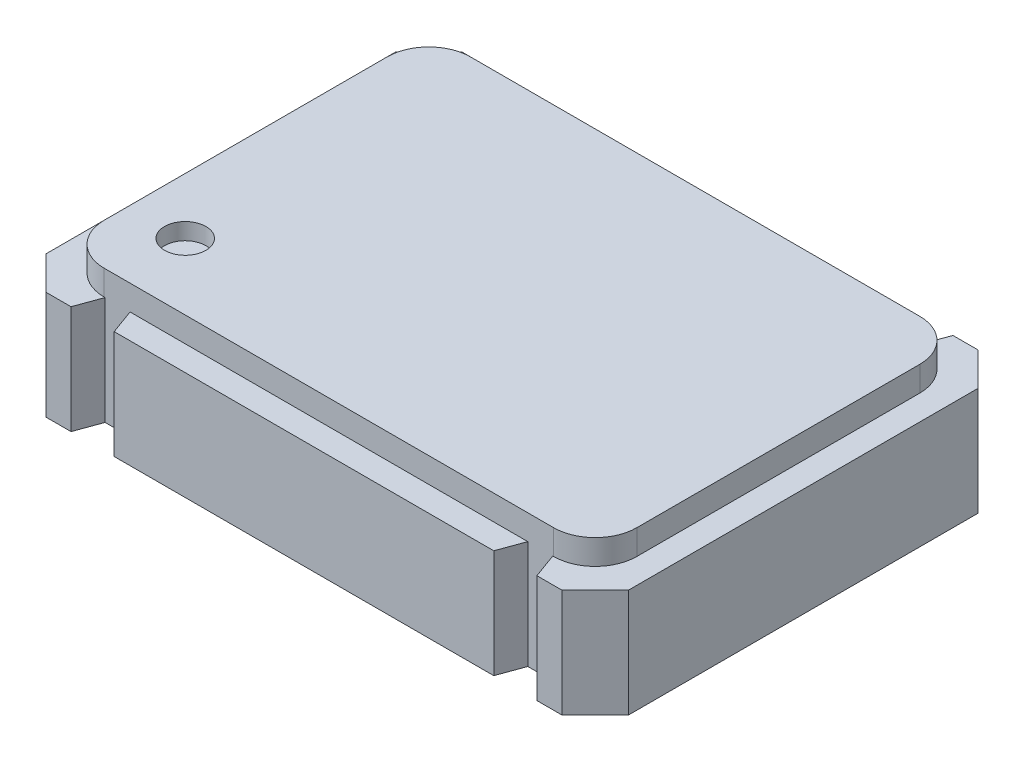
ISO-10303-21;
HEADER;
FILE_DESCRIPTION(('STEP AP214'),'2;1');
FILE_NAME('part.step','',(''),(''),'','','');
FILE_SCHEMA(('AUTOMOTIVE_DESIGN { 1 0 10303 214 1 1 1 1 }'));
ENDSEC;
DATA;
#1=APPLICATION_CONTEXT('core data for automotive mechanical design processes');
#2=APPLICATION_PROTOCOL_DEFINITION('international standard','automotive_design',2000,#1);
#3=PRODUCT_CONTEXT('',#1,'mechanical');
#4=PRODUCT('Part','Part','',(#3));
#5=PRODUCT_RELATED_PRODUCT_CATEGORY('part','',(#4));
#6=PRODUCT_DEFINITION_FORMATION('','',#4);
#7=PRODUCT_DEFINITION_CONTEXT('part definition',#1,'design');
#8=PRODUCT_DEFINITION('design','',#6,#7);
#9=PRODUCT_DEFINITION_SHAPE('','',#8);
#10=(LENGTH_UNIT() NAMED_UNIT(*) SI_UNIT(.MILLI.,.METRE.));
#11=(NAMED_UNIT(*) PLANE_ANGLE_UNIT() SI_UNIT($,.RADIAN.));
#12=(NAMED_UNIT(*) SI_UNIT($,.STERADIAN.) SOLID_ANGLE_UNIT());
#13=UNCERTAINTY_MEASURE_WITH_UNIT(LENGTH_MEASURE(1.E-05),#10,'distance_accuracy_value','');
#14=(GEOMETRIC_REPRESENTATION_CONTEXT(3) GLOBAL_UNCERTAINTY_ASSIGNED_CONTEXT((#13)) GLOBAL_UNIT_ASSIGNED_CONTEXT((#10,
#11,#12)) REPRESENTATION_CONTEXT('',''));
#15=CARTESIAN_POINT('',(0.,0.,0.));
#16=DIRECTION('',(0.,0.,1.));
#17=DIRECTION('',(1.,0.,0.));
#18=AXIS2_PLACEMENT_3D('',#15,#16,#17);
#19=CARTESIAN_POINT('',(2.69,1.3,-2.2));
#20=DIRECTION('',(0.,0.,1.));
#21=DIRECTION('',(1.,0.,0.));
#22=AXIS2_PLACEMENT_3D('',#19,#20,#21);
#23=PLANE('',#22);
#24=DIRECTION('',(-1.,0.,0.));
#25=VECTOR('',#24,1.);
#26=CARTESIAN_POINT('',(-3.2,1.6,-2.2));
#27=LINE('',#26,#25);
#28=CARTESIAN_POINT('',(2.7,1.6,-2.2));
#29=VERTEX_POINT('',#28);
#30=CARTESIAN_POINT('',(-2.7,1.6,-2.2));
#31=VERTEX_POINT('',#30);
#32=EDGE_CURVE('E412',#29,#31,#27,.T.);
#33=ORIENTED_EDGE('',*,*,#32,.F.);
#34=DIRECTION('',(0.,-1.,0.));
#35=VECTOR('',#34,1.);
#36=CARTESIAN_POINT('',(2.7,1.3,-2.2));
#37=LINE('',#36,#35);
#38=CARTESIAN_POINT('',(2.7,1.3,-2.2));
#39=VERTEX_POINT('',#38);
#40=EDGE_CURVE('E358',#29,#39,#37,.T.);
#41=ORIENTED_EDGE('',*,*,#40,.T.);
#42=DIRECTION('',(-1.,0.,0.));
#43=VECTOR('',#42,1.);
#44=CARTESIAN_POINT('',(-3.2,1.3,-2.2));
#45=LINE('',#44,#43);
#46=CARTESIAN_POINT('',(2.69,1.3,-2.2));
#47=VERTEX_POINT('',#46);
#48=EDGE_CURVE('E318',#39,#47,#45,.T.);
#49=ORIENTED_EDGE('',*,*,#48,.T.);
#50=DIRECTION('',(0.,-1.,0.));
#51=VECTOR('',#50,1.);
#52=CARTESIAN_POINT('',(2.69,1.3,-2.2));
#53=LINE('',#52,#51);
#54=CARTESIAN_POINT('',(2.69,0.,-2.2));
#55=VERTEX_POINT('',#54);
#56=EDGE_CURVE('E473',#47,#55,#53,.T.);
#57=ORIENTED_EDGE('',*,*,#56,.T.);
#58=DIRECTION('',(-1.,0.,0.));
#59=VECTOR('',#58,1.);
#60=CARTESIAN_POINT('',(2.69,0.,-2.2));
#61=LINE('',#60,#59);
#62=CARTESIAN_POINT('',(2.39,0.,-2.2));
#63=VERTEX_POINT('',#62);
#64=EDGE_CURVE('E253',#55,#63,#61,.T.);
#65=ORIENTED_EDGE('',*,*,#64,.T.);
#66=DIRECTION('',(0.,-1.,0.));
#67=VECTOR('',#66,1.);
#68=CARTESIAN_POINT('',(2.39,0.,-2.2));
#69=LINE('',#68,#67);
#70=CARTESIAN_POINT('',(2.39,1.3,-2.2));
#71=VERTEX_POINT('',#70);
#72=EDGE_CURVE('E281',#71,#63,#69,.T.);
#73=ORIENTED_EDGE('',*,*,#72,.F.);
#74=DIRECTION('',(1.,0.,0.));
#75=VECTOR('',#74,1.);
#76=CARTESIAN_POINT('',(2.39,1.3,-2.2));
#77=LINE('',#76,#75);
#78=CARTESIAN_POINT('',(-2.39,1.3,-2.2));
#79=VERTEX_POINT('',#78);
#80=EDGE_CURVE('E260',#79,#71,#77,.T.);
#81=ORIENTED_EDGE('',*,*,#80,.F.);
#82=DIRECTION('',(0.,1.,0.));
#83=VECTOR('',#82,1.);
#84=CARTESIAN_POINT('',(-2.39,1.3,-2.2));
#85=LINE('',#84,#83);
#86=CARTESIAN_POINT('',(-2.39,0.,-2.2));
#87=VERTEX_POINT('',#86);
#88=EDGE_CURVE('E257',#87,#79,#85,.T.);
#89=ORIENTED_EDGE('',*,*,#88,.F.);
#90=CARTESIAN_POINT('',(-2.69,0.,-2.2));
#91=VERTEX_POINT('',#90);
#92=EDGE_CURVE('E240',#87,#91,#61,.T.);
#93=ORIENTED_EDGE('',*,*,#92,.T.);
#94=DIRECTION('',(0.,-1.,0.));
#95=VECTOR('',#94,1.);
#96=CARTESIAN_POINT('',(-2.69,1.3,-2.2));
#97=LINE('',#96,#95);
#98=CARTESIAN_POINT('',(-2.69,1.3,-2.2));
#99=VERTEX_POINT('',#98);
#100=EDGE_CURVE('E399',#99,#91,#97,.T.);
#101=ORIENTED_EDGE('',*,*,#100,.F.);
#102=CARTESIAN_POINT('',(-2.7,1.3,-2.2));
#103=VERTEX_POINT('',#102);
#104=EDGE_CURVE('E392',#99,#103,#45,.T.);
#105=ORIENTED_EDGE('',*,*,#104,.T.);
#106=DIRECTION('',(0.,-1.,0.));
#107=VECTOR('',#106,1.);
#108=CARTESIAN_POINT('',(-2.7,1.3,-2.2));
#109=LINE('',#108,#107);
#110=EDGE_CURVE('E356',#103,#31,#109,.F.);
#111=ORIENTED_EDGE('',*,*,#110,.T.);
#112=EDGE_LOOP('',(#33,#41,#49,#57,#65,#73,#81,#89,#93,#101,#105,#111));
#113=FACE_BOUND('',#112,.T.);
#114=ADVANCED_FACE('F33',(#113),#23,.F.);
#115=CARTESIAN_POINT('',(-2.69,1.3,2.2));
#116=DIRECTION('',(0.,0.,-1.));
#117=DIRECTION('',(-1.,0.,0.));
#118=AXIS2_PLACEMENT_3D('',#115,#116,#117);
#119=PLANE('',#118);
#120=DIRECTION('',(1.,0.,0.));
#121=VECTOR('',#120,1.);
#122=CARTESIAN_POINT('',(3.2,1.3,2.2));
#123=LINE('',#122,#121);
#124=CARTESIAN_POINT('',(2.69,1.3,2.2));
#125=VERTEX_POINT('',#124);
#126=CARTESIAN_POINT('',(2.7,1.3,2.2));
#127=VERTEX_POINT('',#126);
#128=EDGE_CURVE('E323',#125,#127,#123,.T.);
#129=ORIENTED_EDGE('',*,*,#128,.T.);
#130=DIRECTION('',(0.,-1.,0.));
#131=VECTOR('',#130,1.);
#132=CARTESIAN_POINT('',(2.7,1.3,2.2));
#133=LINE('',#132,#131);
#134=CARTESIAN_POINT('',(2.7,1.6,2.2));
#135=VERTEX_POINT('',#134);
#136=EDGE_CURVE('E381',#127,#135,#133,.F.);
#137=ORIENTED_EDGE('',*,*,#136,.T.);
#138=DIRECTION('',(1.,0.,0.));
#139=VECTOR('',#138,1.);
#140=CARTESIAN_POINT('',(3.2,1.6,2.2));
#141=LINE('',#140,#139);
#142=CARTESIAN_POINT('',(-2.7,1.6,2.2));
#143=VERTEX_POINT('',#142);
#144=EDGE_CURVE('E415',#143,#135,#141,.T.);
#145=ORIENTED_EDGE('',*,*,#144,.F.);
#146=DIRECTION('',(0.,-1.,0.));
#147=VECTOR('',#146,1.);
#148=CARTESIAN_POINT('',(-2.7,1.3,2.2));
#149=LINE('',#148,#147);
#150=CARTESIAN_POINT('',(-2.7,1.3,2.2));
#151=VERTEX_POINT('',#150);
#152=EDGE_CURVE('E379',#143,#151,#149,.T.);
#153=ORIENTED_EDGE('',*,*,#152,.T.);
#154=CARTESIAN_POINT('',(-2.69,1.3,2.2));
#155=VERTEX_POINT('',#154);
#156=EDGE_CURVE('E427',#151,#155,#123,.T.);
#157=ORIENTED_EDGE('',*,*,#156,.T.);
#158=DIRECTION('',(0.,-1.,0.));
#159=VECTOR('',#158,1.);
#160=CARTESIAN_POINT('',(-2.69,1.3,2.2));
#161=LINE('',#160,#159);
#162=CARTESIAN_POINT('',(-2.69,0.,2.2));
#163=VERTEX_POINT('',#162);
#164=EDGE_CURVE('E479',#155,#163,#161,.T.);
#165=ORIENTED_EDGE('',*,*,#164,.T.);
#166=DIRECTION('',(1.,0.,0.));
#167=VECTOR('',#166,1.);
#168=CARTESIAN_POINT('',(-2.69,0.,2.2));
#169=LINE('',#168,#167);
#170=CARTESIAN_POINT('',(-2.39,0.,2.2));
#171=VERTEX_POINT('',#170);
#172=EDGE_CURVE('E289',#163,#171,#169,.T.);
#173=ORIENTED_EDGE('',*,*,#172,.T.);
#174=DIRECTION('',(0.,-1.,0.));
#175=VECTOR('',#174,1.);
#176=CARTESIAN_POINT('',(-2.39,0.,2.2));
#177=LINE('',#176,#175);
#178=CARTESIAN_POINT('',(-2.39,1.3,2.2));
#179=VERTEX_POINT('',#178);
#180=EDGE_CURVE('E315',#179,#171,#177,.T.);
#181=ORIENTED_EDGE('',*,*,#180,.F.);
#182=DIRECTION('',(-1.,0.,0.));
#183=VECTOR('',#182,1.);
#184=CARTESIAN_POINT('',(-2.39,1.3,2.2));
#185=LINE('',#184,#183);
#186=CARTESIAN_POINT('',(2.39,1.3,2.2));
#187=VERTEX_POINT('',#186);
#188=EDGE_CURVE('E504',#187,#179,#185,.T.);
#189=ORIENTED_EDGE('',*,*,#188,.F.);
#190=DIRECTION('',(0.,1.,0.));
#191=VECTOR('',#190,1.);
#192=CARTESIAN_POINT('',(2.39,1.3,2.2));
#193=LINE('',#192,#191);
#194=CARTESIAN_POINT('',(2.39,0.,2.2));
#195=VERTEX_POINT('',#194);
#196=EDGE_CURVE('E284',#195,#187,#193,.T.);
#197=ORIENTED_EDGE('',*,*,#196,.F.);
#198=CARTESIAN_POINT('',(2.69,0.,2.2));
#199=VERTEX_POINT('',#198);
#200=EDGE_CURVE('E425',#195,#199,#169,.T.);
#201=ORIENTED_EDGE('',*,*,#200,.T.);
#202=DIRECTION('',(0.,-1.,0.));
#203=VECTOR('',#202,1.);
#204=CARTESIAN_POINT('',(2.69,1.3,2.2));
#205=LINE('',#204,#203);
#206=EDGE_CURVE('E297',#125,#199,#205,.T.);
#207=ORIENTED_EDGE('',*,*,#206,.F.);
#208=EDGE_LOOP('',(#129,#137,#145,#153,#157,#165,#173,#181,#189,#197,#201,#207));
#209=FACE_BOUND('',#208,.T.);
#210=ADVANCED_FACE('F524',(#209),#119,.F.);
#211=CARTESIAN_POINT('',(0.,1.3,0.));
#212=DIRECTION('',(0.,1.,0.));
#213=DIRECTION('',(0.,0.,1.));
#214=AXIS2_PLACEMENT_3D('',#211,#212,#213);
#215=PLANE('',#214);
#216=DIRECTION('',(-0.707106781186547,0.,-0.707106781186548));
#217=VECTOR('',#216,1.);
#218=CARTESIAN_POINT('',(3.5,1.3,-2.1));
#219=LINE('',#218,#217);
#220=CARTESIAN_POINT('',(3.5,1.3,-2.1));
#221=VERTEX_POINT('',#220);
#222=CARTESIAN_POINT('',(3.1,1.3,-2.5));
#223=VERTEX_POINT('',#222);
#224=EDGE_CURVE('E452',#221,#223,#219,.T.);
#225=ORIENTED_EDGE('',*,*,#224,.T.);
#226=DIRECTION('',(1.,0.,0.));
#227=VECTOR('',#226,1.);
#228=CARTESIAN_POINT('',(0.,1.3,-2.50000000000001));
#229=LINE('',#228,#227);
#230=CARTESIAN_POINT('',(2.79919107027986,1.3,-2.5));
#231=VERTEX_POINT('',#230);
#232=EDGE_CURVE('E347',#223,#231,#229,.F.);
#233=ORIENTED_EDGE('',*,*,#232,.T.);
#234=DIRECTION('',(0.342020143325667,0.,-0.939692620785909));
#235=VECTOR('',#234,1.);
#236=CARTESIAN_POINT('',(2.69,1.3,-2.2));
#237=LINE('',#236,#235);
#238=EDGE_CURVE('E483',#231,#47,#237,.F.);
#239=ORIENTED_EDGE('',*,*,#238,.T.);
#240=ORIENTED_EDGE('',*,*,#48,.F.);
#241=CARTESIAN_POINT('',(2.7,1.3,-1.7));
#242=DIRECTION('',(0.,1.,0.));
#243=DIRECTION('',(0.,0.,1.));
#244=AXIS2_PLACEMENT_3D('',#241,#242,#243);
#245=CIRCLE('',#244,0.5);
#246=CARTESIAN_POINT('',(3.2,1.3,-1.7));
#247=VERTEX_POINT('',#246);
#248=EDGE_CURVE('E383',#39,#247,#245,.F.);
#249=ORIENTED_EDGE('',*,*,#248,.T.);
#250=DIRECTION('',(0.,0.,-1.));
#251=VECTOR('',#250,1.);
#252=CARTESIAN_POINT('',(3.2,1.3,-2.2));
#253=LINE('',#252,#251);
#254=CARTESIAN_POINT('',(3.2,1.3,1.7));
#255=VERTEX_POINT('',#254);
#256=EDGE_CURVE('E420',#255,#247,#253,.T.);
#257=ORIENTED_EDGE('',*,*,#256,.F.);
#258=CARTESIAN_POINT('',(2.7,1.3,1.7));
#259=DIRECTION('',(0.,1.,0.));
#260=DIRECTION('',(0.,0.,1.));
#261=AXIS2_PLACEMENT_3D('',#258,#259,#260);
#262=CIRCLE('',#261,0.5);
#263=EDGE_CURVE('E41',#255,#127,#262,.F.);
#264=ORIENTED_EDGE('',*,*,#263,.T.);
#265=ORIENTED_EDGE('',*,*,#128,.F.);
#266=DIRECTION('',(-0.342020143325667,0.,-0.939692620785909));
#267=VECTOR('',#266,1.);
#268=CARTESIAN_POINT('',(2.69,1.3,2.2));
#269=LINE('',#268,#267);
#270=CARTESIAN_POINT('',(2.79919107027986,1.3,2.5));
#271=VERTEX_POINT('',#270);
#272=EDGE_CURVE('E290',#125,#271,#269,.F.);
#273=ORIENTED_EDGE('',*,*,#272,.T.);
#274=DIRECTION('',(-1.,0.,0.));
#275=VECTOR('',#274,1.);
#276=CARTESIAN_POINT('',(0.,1.3,2.49999999999999));
#277=LINE('',#276,#275);
#278=CARTESIAN_POINT('',(3.1,1.3,2.5));
#279=VERTEX_POINT('',#278);
#280=EDGE_CURVE('E329',#271,#279,#277,.F.);
#281=ORIENTED_EDGE('',*,*,#280,.T.);
#282=DIRECTION('',(0.707106781186548,0.,-0.707106781186547));
#283=VECTOR('',#282,1.);
#284=CARTESIAN_POINT('',(0.,1.3,5.6));
#285=LINE('',#284,#283);
#286=CARTESIAN_POINT('',(3.5,1.3,2.1));
#287=VERTEX_POINT('',#286);
#288=EDGE_CURVE('E435',#279,#287,#285,.T.);
#289=ORIENTED_EDGE('',*,*,#288,.T.);
#290=DIRECTION('',(0.,0.,-1.));
#291=VECTOR('',#290,1.);
#292=CARTESIAN_POINT('',(3.5,1.3,2.1));
#293=LINE('',#292,#291);
#294=EDGE_CURVE('E449',#287,#221,#293,.T.);
#295=ORIENTED_EDGE('',*,*,#294,.T.);
#296=EDGE_LOOP('',(#225,#233,#239,#240,#249,#257,#264,#265,#273,#281,#289,#295));
#297=FACE_BOUND('',#296,.T.);
#298=ADVANCED_FACE('F545',(#297),#215,.T.);
#299=CARTESIAN_POINT('',(3.5,0.,2.1));
#300=DIRECTION('',(1.,0.,0.));
#301=DIRECTION('',(0.,0.,-1.));
#302=AXIS2_PLACEMENT_3D('',#299,#300,#301);
#303=PLANE('',#302);
#304=ORIENTED_EDGE('',*,*,#294,.F.);
#305=DIRECTION('',(0.,1.,0.));
#306=VECTOR('',#305,1.);
#307=CARTESIAN_POINT('',(3.5,0.,2.1));
#308=LINE('',#307,#306);
#309=CARTESIAN_POINT('',(3.5,0.,2.1));
#310=VERTEX_POINT('',#309);
#311=EDGE_CURVE('E401',#310,#287,#308,.T.);
#312=ORIENTED_EDGE('',*,*,#311,.F.);
#313=DIRECTION('',(0.,0.,-1.));
#314=VECTOR('',#313,1.);
#315=CARTESIAN_POINT('',(3.5,0.,2.1));
#316=LINE('',#315,#314);
#317=CARTESIAN_POINT('',(3.5,0.,-2.1));
#318=VERTEX_POINT('',#317);
#319=EDGE_CURVE('E431',#310,#318,#316,.T.);
#320=ORIENTED_EDGE('',*,*,#319,.T.);
#321=DIRECTION('',(0.,1.,0.));
#322=VECTOR('',#321,1.);
#323=CARTESIAN_POINT('',(3.5,0.,-2.1));
#324=LINE('',#323,#322);
#325=EDGE_CURVE('E448',#318,#221,#324,.T.);
#326=ORIENTED_EDGE('',*,*,#325,.T.);
#327=EDGE_LOOP('',(#304,#312,#320,#326));
#328=FACE_BOUND('',#327,.T.);
#329=ADVANCED_FACE('F559',(#328),#303,.T.);
#330=CARTESIAN_POINT('',(0.,0.,5.6));
#331=DIRECTION('',(0.707106781186547,0.,0.707106781186548));
#332=DIRECTION('',(0.707106781186548,0.,-0.707106781186547));
#333=AXIS2_PLACEMENT_3D('',#330,#331,#332);
#334=PLANE('',#333);
#335=ORIENTED_EDGE('',*,*,#288,.F.);
#336=DIRECTION('',(0.,-1.,0.));
#337=VECTOR('',#336,1.);
#338=CARTESIAN_POINT('',(3.1,0.,2.5));
#339=LINE('',#338,#337);
#340=CARTESIAN_POINT('',(3.1,0.,2.5));
#341=VERTEX_POINT('',#340);
#342=EDGE_CURVE('E319',#279,#341,#339,.T.);
#343=ORIENTED_EDGE('',*,*,#342,.T.);
#344=DIRECTION('',(0.707106781186548,0.,-0.707106781186547));
#345=VECTOR('',#344,1.);
#346=CARTESIAN_POINT('',(0.,0.,5.6));
#347=LINE('',#346,#345);
#348=EDGE_CURVE('E446',#341,#310,#347,.T.);
#349=ORIENTED_EDGE('',*,*,#348,.T.);
#350=ORIENTED_EDGE('',*,*,#311,.T.);
#351=EDGE_LOOP('',(#335,#343,#349,#350));
#352=FACE_BOUND('',#351,.T.);
#353=ADVANCED_FACE('F555',(#352),#334,.T.);
#354=CARTESIAN_POINT('',(-3.5,0.,2.1));
#355=DIRECTION('',(-0.707106781186548,0.,0.707106781186547));
#356=DIRECTION('',(0.707106781186547,0.,0.707106781186548));
#357=AXIS2_PLACEMENT_3D('',#354,#355,#356);
#358=PLANE('',#357);
#359=DIRECTION('',(0.707106781186547,0.,0.707106781186548));
#360=VECTOR('',#359,1.);
#361=CARTESIAN_POINT('',(-3.5,0.,2.1));
#362=LINE('',#361,#360);
#363=CARTESIAN_POINT('',(-3.5,0.,2.1));
#364=VERTEX_POINT('',#363);
#365=CARTESIAN_POINT('',(-3.1,0.,2.5));
#366=VERTEX_POINT('',#365);
#367=EDGE_CURVE('E443',#364,#366,#362,.T.);
#368=ORIENTED_EDGE('',*,*,#367,.T.);
#369=DIRECTION('',(0.,1.,0.));
#370=VECTOR('',#369,1.);
#371=CARTESIAN_POINT('',(-3.1,1.3,2.5));
#372=LINE('',#371,#370);
#373=CARTESIAN_POINT('',(-3.1,1.3,2.5));
#374=VERTEX_POINT('',#373);
#375=EDGE_CURVE('E352',#366,#374,#372,.T.);
#376=ORIENTED_EDGE('',*,*,#375,.T.);
#377=DIRECTION('',(0.707106781186547,0.,0.707106781186548));
#378=VECTOR('',#377,1.);
#379=CARTESIAN_POINT('',(-3.5,1.3,2.1));
#380=LINE('',#379,#378);
#381=CARTESIAN_POINT('',(-3.5,1.3,2.1));
#382=VERTEX_POINT('',#381);
#383=EDGE_CURVE('E460',#382,#374,#380,.T.);
#384=ORIENTED_EDGE('',*,*,#383,.F.);
#385=DIRECTION('',(0.,1.,0.));
#386=VECTOR('',#385,1.);
#387=CARTESIAN_POINT('',(-3.5,0.,2.1));
#388=LINE('',#387,#386);
#389=EDGE_CURVE('E465',#364,#382,#388,.T.);
#390=ORIENTED_EDGE('',*,*,#389,.F.);
#391=EDGE_LOOP('',(#368,#376,#384,#390));
#392=FACE_BOUND('',#391,.T.);
#393=ADVANCED_FACE('F558',(#392),#358,.T.);
#394=CARTESIAN_POINT('',(-3.5,0.,-2.1));
#395=DIRECTION('',(-1.,0.,0.));
#396=DIRECTION('',(0.,0.,1.));
#397=AXIS2_PLACEMENT_3D('',#394,#395,#396);
#398=PLANE('',#397);
#399=DIRECTION('',(0.,0.,1.));
#400=VECTOR('',#399,1.);
#401=CARTESIAN_POINT('',(-3.5,1.3,-2.1));
#402=LINE('',#401,#400);
#403=CARTESIAN_POINT('',(-3.5,1.3,-2.1));
#404=VERTEX_POINT('',#403);
#405=EDGE_CURVE('E457',#404,#382,#402,.T.);
#406=ORIENTED_EDGE('',*,*,#405,.F.);
#407=DIRECTION('',(0.,1.,0.));
#408=VECTOR('',#407,1.);
#409=CARTESIAN_POINT('',(-3.5,0.,-2.1));
#410=LINE('',#409,#408);
#411=CARTESIAN_POINT('',(-3.5,0.,-2.1));
#412=VERTEX_POINT('',#411);
#413=EDGE_CURVE('E467',#412,#404,#410,.T.);
#414=ORIENTED_EDGE('',*,*,#413,.F.);
#415=DIRECTION('',(0.,0.,1.));
#416=VECTOR('',#415,1.);
#417=CARTESIAN_POINT('',(-3.5,0.,-2.1));
#418=LINE('',#417,#416);
#419=EDGE_CURVE('E440',#412,#364,#418,.T.);
#420=ORIENTED_EDGE('',*,*,#419,.T.);
#421=ORIENTED_EDGE('',*,*,#389,.T.);
#422=EDGE_LOOP('',(#406,#414,#420,#421));
#423=FACE_BOUND('',#422,.T.);
#424=ADVANCED_FACE('F563',(#423),#398,.T.);
#425=CARTESIAN_POINT('',(0.,0.,-5.6));
#426=DIRECTION('',(-0.707106781186547,0.,-0.707106781186548));
#427=DIRECTION('',(-0.707106781186548,0.,0.707106781186547));
#428=AXIS2_PLACEMENT_3D('',#425,#426,#427);
#429=PLANE('',#428);
#430=DIRECTION('',(-0.707106781186548,0.,0.707106781186547));
#431=VECTOR('',#430,1.);
#432=CARTESIAN_POINT('',(0.,1.3,-5.6));
#433=LINE('',#432,#431);
#434=CARTESIAN_POINT('',(-3.1,1.3,-2.5));
#435=VERTEX_POINT('',#434);
#436=EDGE_CURVE('E455',#435,#404,#433,.T.);
#437=ORIENTED_EDGE('',*,*,#436,.F.);
#438=DIRECTION('',(0.,-1.,0.));
#439=VECTOR('',#438,1.);
#440=CARTESIAN_POINT('',(-3.1,0.,-2.5));
#441=LINE('',#440,#439);
#442=CARTESIAN_POINT('',(-3.1,0.,-2.5));
#443=VERTEX_POINT('',#442);
#444=EDGE_CURVE('E331',#435,#443,#441,.T.);
#445=ORIENTED_EDGE('',*,*,#444,.T.);
#446=DIRECTION('',(-0.707106781186548,0.,0.707106781186547));
#447=VECTOR('',#446,1.);
#448=CARTESIAN_POINT('',(0.,0.,-5.6));
#449=LINE('',#448,#447);
#450=EDGE_CURVE('E438',#443,#412,#449,.T.);
#451=ORIENTED_EDGE('',*,*,#450,.T.);
#452=ORIENTED_EDGE('',*,*,#413,.T.);
#453=EDGE_LOOP('',(#437,#445,#451,#452));
#454=FACE_BOUND('',#453,.T.);
#455=ADVANCED_FACE('F567',(#454),#429,.T.);
#456=CARTESIAN_POINT('',(3.5,0.,-2.1));
#457=DIRECTION('',(0.707106781186548,0.,-0.707106781186547));
#458=DIRECTION('',(-0.707106781186547,0.,-0.707106781186548));
#459=AXIS2_PLACEMENT_3D('',#456,#457,#458);
#460=PLANE('',#459);
#461=DIRECTION('',(-0.707106781186547,0.,-0.707106781186548));
#462=VECTOR('',#461,1.);
#463=CARTESIAN_POINT('',(3.5,0.,-2.1));
#464=LINE('',#463,#462);
#465=CARTESIAN_POINT('',(3.1,0.,-2.5));
#466=VERTEX_POINT('',#465);
#467=EDGE_CURVE('E434',#318,#466,#464,.T.);
#468=ORIENTED_EDGE('',*,*,#467,.T.);
#469=DIRECTION('',(0.,1.,0.));
#470=VECTOR('',#469,1.);
#471=CARTESIAN_POINT('',(3.1,1.3,-2.5));
#472=LINE('',#471,#470);
#473=EDGE_CURVE('E345',#466,#223,#472,.T.);
#474=ORIENTED_EDGE('',*,*,#473,.T.);
#475=ORIENTED_EDGE('',*,*,#224,.F.);
#476=ORIENTED_EDGE('',*,*,#325,.F.);
#477=EDGE_LOOP('',(#468,#474,#475,#476));
#478=FACE_BOUND('',#477,.T.);
#479=ADVANCED_FACE('F551',(#478),#460,.T.);
#480=CARTESIAN_POINT('',(0.,0.,0.));
#481=DIRECTION('',(0.,1.,0.));
#482=DIRECTION('',(0.,0.,1.));
#483=AXIS2_PLACEMENT_3D('',#480,#481,#482);
#484=PLANE('',#483);
#485=DIRECTION('',(0.342020143325667,0.,-0.939692620785909));
#486=VECTOR('',#485,1.);
#487=CARTESIAN_POINT('',(2.69,0.,-2.2));
#488=LINE('',#487,#486);
#489=CARTESIAN_POINT('',(2.79919107027986,0.,-2.5));
#490=VERTEX_POINT('',#489);
#491=EDGE_CURVE('E254',#490,#55,#488,.F.);
#492=ORIENTED_EDGE('',*,*,#491,.F.);
#493=DIRECTION('',(-1.,0.,0.));
#494=VECTOR('',#493,1.);
#495=CARTESIAN_POINT('',(2.79919107027986,0.,-2.5));
#496=LINE('',#495,#494);
#497=EDGE_CURVE('E343',#490,#466,#496,.F.);
#498=ORIENTED_EDGE('',*,*,#497,.T.);
#499=ORIENTED_EDGE('',*,*,#467,.F.);
#500=ORIENTED_EDGE('',*,*,#319,.F.);
#501=ORIENTED_EDGE('',*,*,#348,.F.);
#502=DIRECTION('',(1.,0.,0.));
#503=VECTOR('',#502,1.);
#504=CARTESIAN_POINT('',(3.1,0.,2.5));
#505=LINE('',#504,#503);
#506=CARTESIAN_POINT('',(2.79919107027986,0.,2.5));
#507=VERTEX_POINT('',#506);
#508=EDGE_CURVE('E325',#341,#507,#505,.F.);
#509=ORIENTED_EDGE('',*,*,#508,.T.);
#510=DIRECTION('',(-0.342020143325667,0.,-0.939692620785909));
#511=VECTOR('',#510,1.);
#512=CARTESIAN_POINT('',(2.69,0.,2.2));
#513=LINE('',#512,#511);
#514=EDGE_CURVE('E285',#199,#507,#513,.F.);
#515=ORIENTED_EDGE('',*,*,#514,.F.);
#516=ORIENTED_EDGE('',*,*,#200,.F.);
#517=DIRECTION('',(-0.342020143325667,0.,0.939692620785909));
#518=VECTOR('',#517,1.);
#519=CARTESIAN_POINT('',(2.39,0.,2.2));
#520=LINE('',#519,#518);
#521=CARTESIAN_POINT('',(2.28080892972014,0.,2.5));
#522=VERTEX_POINT('',#521);
#523=EDGE_CURVE('E309',#522,#195,#520,.F.);
#524=ORIENTED_EDGE('',*,*,#523,.F.);
#525=DIRECTION('',(1.,0.,0.));
#526=VECTOR('',#525,1.);
#527=CARTESIAN_POINT('',(2.39,0.,2.5));
#528=LINE('',#527,#526);
#529=CARTESIAN_POINT('',(-2.28080892972014,0.,2.5));
#530=VERTEX_POINT('',#529);
#531=EDGE_CURVE('E305',#530,#522,#528,.T.);
#532=ORIENTED_EDGE('',*,*,#531,.F.);
#533=DIRECTION('',(0.342020143325667,0.,0.939692620785909));
#534=VECTOR('',#533,1.);
#535=CARTESIAN_POINT('',(-2.81748948018237,0.,1.02548230614453));
#536=LINE('',#535,#534);
#537=EDGE_CURVE('E302',#530,#171,#536,.F.);
#538=ORIENTED_EDGE('',*,*,#537,.T.);
#539=ORIENTED_EDGE('',*,*,#172,.F.);
#540=DIRECTION('',(-0.342020143325667,0.,0.939692620785909));
#541=VECTOR('',#540,1.);
#542=CARTESIAN_POINT('',(-2.69,0.,2.2));
#543=LINE('',#542,#541);
#544=CARTESIAN_POINT('',(-2.79919107027986,0.,2.5));
#545=VERTEX_POINT('',#544);
#546=EDGE_CURVE('E288',#545,#163,#543,.F.);
#547=ORIENTED_EDGE('',*,*,#546,.F.);
#548=DIRECTION('',(1.,0.,0.));
#549=VECTOR('',#548,1.);
#550=CARTESIAN_POINT('',(-2.79919107027986,0.,2.5));
#551=LINE('',#550,#549);
#552=EDGE_CURVE('E341',#545,#366,#551,.F.);
#553=ORIENTED_EDGE('',*,*,#552,.T.);
#554=ORIENTED_EDGE('',*,*,#367,.F.);
#555=ORIENTED_EDGE('',*,*,#419,.F.);
#556=ORIENTED_EDGE('',*,*,#450,.F.);
#557=DIRECTION('',(-1.,0.,0.));
#558=VECTOR('',#557,1.);
#559=CARTESIAN_POINT('',(-3.1,0.,-2.5));
#560=LINE('',#559,#558);
#561=CARTESIAN_POINT('',(-2.79919107027986,0.,-2.5));
#562=VERTEX_POINT('',#561);
#563=EDGE_CURVE('E322',#443,#562,#560,.F.);
#564=ORIENTED_EDGE('',*,*,#563,.T.);
#565=DIRECTION('',(0.342020143325667,0.,0.939692620785909));
#566=VECTOR('',#565,1.);
#567=CARTESIAN_POINT('',(-2.69,0.,-2.2));
#568=LINE('',#567,#566);
#569=EDGE_CURVE('E249',#91,#562,#568,.F.);
#570=ORIENTED_EDGE('',*,*,#569,.F.);
#571=ORIENTED_EDGE('',*,*,#92,.F.);
#572=DIRECTION('',(0.342020143325667,0.,-0.939692620785909));
#573=VECTOR('',#572,1.);
#574=CARTESIAN_POINT('',(-2.39,0.,-2.2));
#575=LINE('',#574,#573);
#576=CARTESIAN_POINT('',(-2.28080892972014,0.,-2.5));
#577=VERTEX_POINT('',#576);
#578=EDGE_CURVE('E246',#577,#87,#575,.F.);
#579=ORIENTED_EDGE('',*,*,#578,.F.);
#580=DIRECTION('',(-1.,0.,0.));
#581=VECTOR('',#580,1.);
#582=CARTESIAN_POINT('',(-2.39,0.,-2.5));
#583=LINE('',#582,#581);
#584=CARTESIAN_POINT('',(2.28080892972014,0.,-2.5));
#585=VERTEX_POINT('',#584);
#586=EDGE_CURVE('E270',#585,#577,#583,.T.);
#587=ORIENTED_EDGE('',*,*,#586,.F.);
#588=DIRECTION('',(-0.342020143325667,0.,-0.939692620785909));
#589=VECTOR('',#588,1.);
#590=CARTESIAN_POINT('',(2.81748948018237,0.,-1.02548230614453));
#591=LINE('',#590,#589);
#592=EDGE_CURVE('E269',#585,#63,#591,.F.);
#593=ORIENTED_EDGE('',*,*,#592,.T.);
#594=ORIENTED_EDGE('',*,*,#64,.F.);
#595=EDGE_LOOP('',(#492,#498,#499,#500,#501,#509,#515,#516,#524,#532,#538,#539,#547,#553,#554,
#555,#556,#564,#570,#571,#579,#587,#593,#594));
#596=FACE_BOUND('',#595,.T.);
#597=ADVANCED_FACE('F243',(#596),#484,.F.);
#598=ORIENTED_EDGE('',*,*,#383,.T.);
#599=DIRECTION('',(-1.,0.,0.));
#600=VECTOR('',#599,1.);
#601=CARTESIAN_POINT('',(0.,1.3,2.50000000000001));
#602=LINE('',#601,#600);
#603=CARTESIAN_POINT('',(-2.79919107027986,1.3,2.5));
#604=VERTEX_POINT('',#603);
#605=EDGE_CURVE('E354',#374,#604,#602,.F.);
#606=ORIENTED_EDGE('',*,*,#605,.T.);
#607=DIRECTION('',(-0.342020143325667,0.,0.939692620785909));
#608=VECTOR('',#607,1.);
#609=CARTESIAN_POINT('',(-2.69,1.3,2.2));
#610=LINE('',#609,#608);
#611=EDGE_CURVE('E293',#604,#155,#610,.F.);
#612=ORIENTED_EDGE('',*,*,#611,.T.);
#613=ORIENTED_EDGE('',*,*,#156,.F.);
#614=CARTESIAN_POINT('',(-2.7,1.3,1.7));
#615=DIRECTION('',(0.,1.,0.));
#616=DIRECTION('',(0.,0.,1.));
#617=AXIS2_PLACEMENT_3D('',#614,#615,#616);
#618=CIRCLE('',#617,0.5);
#619=CARTESIAN_POINT('',(-3.2,1.3,1.7));
#620=VERTEX_POINT('',#619);
#621=EDGE_CURVE('E11',#151,#620,#618,.F.);
#622=ORIENTED_EDGE('',*,*,#621,.T.);
#623=DIRECTION('',(0.,0.,1.));
#624=VECTOR('',#623,1.);
#625=CARTESIAN_POINT('',(-3.2,1.3,2.2));
#626=LINE('',#625,#624);
#627=CARTESIAN_POINT('',(-3.2,1.3,-1.7));
#628=VERTEX_POINT('',#627);
#629=EDGE_CURVE('E394',#628,#620,#626,.T.);
#630=ORIENTED_EDGE('',*,*,#629,.F.);
#631=CARTESIAN_POINT('',(-2.7,1.3,-1.7));
#632=DIRECTION('',(0.,1.,0.));
#633=DIRECTION('',(0.,0.,1.));
#634=AXIS2_PLACEMENT_3D('',#631,#632,#633);
#635=CIRCLE('',#634,0.5);
#636=EDGE_CURVE('E385',#628,#103,#635,.F.);
#637=ORIENTED_EDGE('',*,*,#636,.T.);
#638=ORIENTED_EDGE('',*,*,#104,.F.);
#639=DIRECTION('',(0.342020143325667,0.,0.939692620785909));
#640=VECTOR('',#639,1.);
#641=CARTESIAN_POINT('',(-2.69,1.3,-2.2));
#642=LINE('',#641,#640);
#643=CARTESIAN_POINT('',(-2.79919107027986,1.3,-2.5));
#644=VERTEX_POINT('',#643);
#645=EDGE_CURVE('E476',#99,#644,#642,.F.);
#646=ORIENTED_EDGE('',*,*,#645,.T.);
#647=DIRECTION('',(1.,0.,0.));
#648=VECTOR('',#647,1.);
#649=CARTESIAN_POINT('',(0.,1.3,-2.49999999999999));
#650=LINE('',#649,#648);
#651=EDGE_CURVE('E336',#644,#435,#650,.F.);
#652=ORIENTED_EDGE('',*,*,#651,.T.);
#653=ORIENTED_EDGE('',*,*,#436,.T.);
#654=ORIENTED_EDGE('',*,*,#405,.T.);
#655=EDGE_LOOP('',(#598,#606,#612,#613,#622,#630,#637,#638,#646,#652,#653,#654));
#656=FACE_BOUND('',#655,.T.);
#657=ADVANCED_FACE('F390',(#656),#215,.T.);
#658=CARTESIAN_POINT('',(-2.69,1.3,-2.2));
#659=DIRECTION('',(0.939692620785909,0.,-0.342020143325667));
#660=DIRECTION('',(-0.342020143325667,0.,-0.939692620785909));
#661=AXIS2_PLACEMENT_3D('',#658,#659,#660);
#662=PLANE('',#661);
#663=ORIENTED_EDGE('',*,*,#569,.T.);
#664=DIRECTION('',(0.,-1.,0.));
#665=VECTOR('',#664,1.);
#666=CARTESIAN_POINT('',(-2.79919107027986,1.3,-2.5));
#667=LINE('',#666,#665);
#668=EDGE_CURVE('E334',#562,#644,#667,.F.);
#669=ORIENTED_EDGE('',*,*,#668,.T.);
#670=ORIENTED_EDGE('',*,*,#645,.F.);
#671=ORIENTED_EDGE('',*,*,#100,.T.);
#672=EDGE_LOOP('',(#663,#669,#670,#671));
#673=FACE_BOUND('',#672,.T.);
#674=ADVANCED_FACE('F554',(#673),#662,.T.);
#675=CARTESIAN_POINT('',(2.69,1.3,-2.2));
#676=DIRECTION('',(-0.939692620785909,0.,-0.342020143325667));
#677=DIRECTION('',(-0.342020143325667,0.,0.939692620785909));
#678=AXIS2_PLACEMENT_3D('',#675,#676,#677);
#679=PLANE('',#678);
#680=ORIENTED_EDGE('',*,*,#238,.F.);
#681=DIRECTION('',(0.,1.,0.));
#682=VECTOR('',#681,1.);
#683=CARTESIAN_POINT('',(2.79919107027986,0.,-2.5));
#684=LINE('',#683,#682);
#685=EDGE_CURVE('E338',#231,#490,#684,.F.);
#686=ORIENTED_EDGE('',*,*,#685,.T.);
#687=ORIENTED_EDGE('',*,*,#491,.T.);
#688=ORIENTED_EDGE('',*,*,#56,.F.);
#689=EDGE_LOOP('',(#680,#686,#687,#688));
#690=FACE_BOUND('',#689,.T.);
#691=ADVANCED_FACE('F580',(#690),#679,.T.);
#692=CARTESIAN_POINT('',(-2.69,1.3,2.2));
#693=DIRECTION('',(0.939692620785909,0.,0.342020143325667));
#694=DIRECTION('',(0.342020143325667,0.,-0.939692620785909));
#695=AXIS2_PLACEMENT_3D('',#692,#693,#694);
#696=PLANE('',#695);
#697=ORIENTED_EDGE('',*,*,#611,.F.);
#698=DIRECTION('',(0.,1.,0.));
#699=VECTOR('',#698,1.);
#700=CARTESIAN_POINT('',(-2.79919107027986,0.,2.5));
#701=LINE('',#700,#699);
#702=EDGE_CURVE('E349',#604,#545,#701,.F.);
#703=ORIENTED_EDGE('',*,*,#702,.T.);
#704=ORIENTED_EDGE('',*,*,#546,.T.);
#705=ORIENTED_EDGE('',*,*,#164,.F.);
#706=EDGE_LOOP('',(#697,#703,#704,#705));
#707=FACE_BOUND('',#706,.T.);
#708=ADVANCED_FACE('F591',(#707),#696,.T.);
#709=CARTESIAN_POINT('',(2.69,1.3,2.2));
#710=DIRECTION('',(-0.939692620785909,0.,0.342020143325667));
#711=DIRECTION('',(0.342020143325667,0.,0.939692620785909));
#712=AXIS2_PLACEMENT_3D('',#709,#710,#711);
#713=PLANE('',#712);
#714=ORIENTED_EDGE('',*,*,#514,.T.);
#715=DIRECTION('',(0.,-1.,0.));
#716=VECTOR('',#715,1.);
#717=CARTESIAN_POINT('',(2.79919107027986,1.3,2.5));
#718=LINE('',#717,#716);
#719=EDGE_CURVE('E327',#507,#271,#718,.F.);
#720=ORIENTED_EDGE('',*,*,#719,.T.);
#721=ORIENTED_EDGE('',*,*,#272,.F.);
#722=ORIENTED_EDGE('',*,*,#206,.T.);
#723=EDGE_LOOP('',(#714,#720,#721,#722));
#724=FACE_BOUND('',#723,.T.);
#725=ADVANCED_FACE('F593',(#724),#713,.T.);
#726=CARTESIAN_POINT('',(-3.2,1.6,2.2));
#727=DIRECTION('',(1.,0.,0.));
#728=DIRECTION('',(0.,0.,-1.));
#729=AXIS2_PLACEMENT_3D('',#726,#727,#728);
#730=PLANE('',#729);
#731=DIRECTION('',(0.,0.,1.));
#732=VECTOR('',#731,1.);
#733=CARTESIAN_POINT('',(-3.2,1.6,2.2));
#734=LINE('',#733,#732);
#735=CARTESIAN_POINT('',(-3.2,1.6,-1.7));
#736=VERTEX_POINT('',#735);
#737=CARTESIAN_POINT('',(-3.2,1.6,1.7));
#738=VERTEX_POINT('',#737);
#739=EDGE_CURVE('E410',#736,#738,#734,.T.);
#740=ORIENTED_EDGE('',*,*,#739,.F.);
#741=DIRECTION('',(0.,-1.,0.));
#742=VECTOR('',#741,1.);
#743=CARTESIAN_POINT('',(-3.2,1.6,-1.7));
#744=LINE('',#743,#742);
#745=EDGE_CURVE('E376',#736,#628,#744,.T.);
#746=ORIENTED_EDGE('',*,*,#745,.T.);
#747=ORIENTED_EDGE('',*,*,#629,.T.);
#748=DIRECTION('',(0.,-1.,0.));
#749=VECTOR('',#748,1.);
#750=CARTESIAN_POINT('',(-3.2,1.6,1.7));
#751=LINE('',#750,#749);
#752=EDGE_CURVE('E374',#620,#738,#751,.F.);
#753=ORIENTED_EDGE('',*,*,#752,.T.);
#754=EDGE_LOOP('',(#740,#746,#747,#753));
#755=FACE_BOUND('',#754,.T.);
#756=ADVANCED_FACE('F414',(#755),#730,.F.);
#757=CARTESIAN_POINT('',(3.2,1.6,-2.2));
#758=DIRECTION('',(-1.,0.,0.));
#759=DIRECTION('',(0.,0.,1.));
#760=AXIS2_PLACEMENT_3D('',#757,#758,#759);
#761=PLANE('',#760);
#762=ORIENTED_EDGE('',*,*,#256,.T.);
#763=DIRECTION('',(0.,-1.,0.));
#764=VECTOR('',#763,1.);
#765=CARTESIAN_POINT('',(3.2,1.6,-1.7));
#766=LINE('',#765,#764);
#767=CARTESIAN_POINT('',(3.2,1.6,-1.7));
#768=VERTEX_POINT('',#767);
#769=EDGE_CURVE('E364',#247,#768,#766,.F.);
#770=ORIENTED_EDGE('',*,*,#769,.T.);
#771=DIRECTION('',(0.,0.,-1.));
#772=VECTOR('',#771,1.);
#773=CARTESIAN_POINT('',(3.2,1.6,-2.2));
#774=LINE('',#773,#772);
#775=CARTESIAN_POINT('',(3.2,1.6,1.7));
#776=VERTEX_POINT('',#775);
#777=EDGE_CURVE('E418',#776,#768,#774,.T.);
#778=ORIENTED_EDGE('',*,*,#777,.F.);
#779=DIRECTION('',(0.,-1.,0.));
#780=VECTOR('',#779,1.);
#781=CARTESIAN_POINT('',(3.2,1.6,1.7));
#782=LINE('',#781,#780);
#783=EDGE_CURVE('E361',#776,#255,#782,.T.);
#784=ORIENTED_EDGE('',*,*,#783,.T.);
#785=EDGE_LOOP('',(#762,#770,#778,#784));
#786=FACE_BOUND('',#785,.T.);
#787=ADVANCED_FACE('F535',(#786),#761,.F.);
#788=CARTESIAN_POINT('',(0.,1.6,0.));
#789=DIRECTION('',(0.,-1.,0.));
#790=DIRECTION('',(0.,0.,-1.));
#791=AXIS2_PLACEMENT_3D('',#788,#789,#790);
#792=PLANE('',#791);
#793=CARTESIAN_POINT('',(-2.52400040936251,1.6,1.4030636804705));
#794=DIRECTION('',(0.,1.,0.));
#795=DIRECTION('',(0.,0.,1.));
#796=AXIS2_PLACEMENT_3D('',#793,#794,#795);
#797=CIRCLE('',#796,0.248751820486483);
#798=CARTESIAN_POINT('',(-2.52400040936251,1.6,1.65181550095698));
#799=VERTEX_POINT('',#798);
#800=EDGE_CURVE('E909',#799,#799,#797,.T.);
#801=ORIENTED_EDGE('',*,*,#800,.F.);
#802=EDGE_LOOP('',(#801));
#803=FACE_BOUND('',#802,.T.);
#804=ORIENTED_EDGE('',*,*,#777,.T.);
#805=CARTESIAN_POINT('',(2.7,1.6,-1.7));
#806=DIRECTION('',(0.,-1.,0.));
#807=DIRECTION('',(0.,0.,-1.));
#808=AXIS2_PLACEMENT_3D('',#805,#806,#807);
#809=CIRCLE('',#808,0.5);
#810=EDGE_CURVE('E372',#768,#29,#809,.F.);
#811=ORIENTED_EDGE('',*,*,#810,.T.);
#812=ORIENTED_EDGE('',*,*,#32,.T.);
#813=CARTESIAN_POINT('',(-2.7,1.6,-1.7));
#814=DIRECTION('',(0.,-1.,0.));
#815=DIRECTION('',(0.,0.,-1.));
#816=AXIS2_PLACEMENT_3D('',#813,#814,#815);
#817=CIRCLE('',#816,0.5);
#818=EDGE_CURVE('E370',#31,#736,#817,.F.);
#819=ORIENTED_EDGE('',*,*,#818,.T.);
#820=ORIENTED_EDGE('',*,*,#739,.T.);
#821=CARTESIAN_POINT('',(-2.7,1.6,1.7));
#822=DIRECTION('',(0.,-1.,0.));
#823=DIRECTION('',(0.,0.,-1.));
#824=AXIS2_PLACEMENT_3D('',#821,#822,#823);
#825=CIRCLE('',#824,0.5);
#826=EDGE_CURVE('E366',#738,#143,#825,.F.);
#827=ORIENTED_EDGE('',*,*,#826,.T.);
#828=ORIENTED_EDGE('',*,*,#144,.T.);
#829=CARTESIAN_POINT('',(2.7,1.6,1.7));
#830=DIRECTION('',(0.,-1.,0.));
#831=DIRECTION('',(0.,0.,-1.));
#832=AXIS2_PLACEMENT_3D('',#829,#830,#831);
#833=CIRCLE('',#832,0.5);
#834=EDGE_CURVE('E368',#135,#776,#833,.F.);
#835=ORIENTED_EDGE('',*,*,#834,.T.);
#836=EDGE_LOOP('',(#804,#811,#812,#819,#820,#827,#828,#835));
#837=FACE_BOUND('',#836,.T.);
#838=ADVANCED_FACE('F409',(#803,#837),#792,.F.);
#839=CARTESIAN_POINT('',(2.39,1.3,2.2));
#840=DIRECTION('',(0.939692620785909,0.,0.342020143325667));
#841=DIRECTION('',(0.342020143325667,0.,-0.939692620785909));
#842=AXIS2_PLACEMENT_3D('',#839,#840,#841);
#843=PLANE('',#842);
#844=ORIENTED_EDGE('',*,*,#196,.T.);
#845=DIRECTION('',(-0.342020143325667,0.,0.939692620785909));
#846=VECTOR('',#845,1.);
#847=CARTESIAN_POINT('',(1.73442807760138,1.3,4.00116905361867));
#848=LINE('',#847,#846);
#849=CARTESIAN_POINT('',(2.28080892972014,1.3,2.5));
#850=VERTEX_POINT('',#849);
#851=EDGE_CURVE('E301',#850,#187,#848,.F.);
#852=ORIENTED_EDGE('',*,*,#851,.F.);
#853=DIRECTION('',(0.,-1.,0.));
#854=VECTOR('',#853,1.);
#855=CARTESIAN_POINT('',(2.28080892972014,0.,2.5));
#856=LINE('',#855,#854);
#857=EDGE_CURVE('E312',#522,#850,#856,.F.);
#858=ORIENTED_EDGE('',*,*,#857,.F.);
#859=ORIENTED_EDGE('',*,*,#523,.T.);
#860=EDGE_LOOP('',(#844,#852,#858,#859));
#861=FACE_BOUND('',#860,.T.);
#862=ADVANCED_FACE('F527',(#861),#843,.T.);
#863=CARTESIAN_POINT('',(-2.39,1.3,2.5));
#864=DIRECTION('',(0.,-1.,0.));
#865=DIRECTION('',(0.,0.,-1.));
#866=AXIS2_PLACEMENT_3D('',#863,#864,#865);
#867=PLANE('',#866);
#868=ORIENTED_EDGE('',*,*,#188,.T.);
#869=DIRECTION('',(0.342020143325667,0.,0.939692620785909));
#870=VECTOR('',#869,1.);
#871=CARTESIAN_POINT('',(-2.39,1.3,2.2));
#872=LINE('',#871,#870);
#873=CARTESIAN_POINT('',(-2.28080892972014,1.3,2.5));
#874=VERTEX_POINT('',#873);
#875=EDGE_CURVE('E298',#874,#179,#872,.F.);
#876=ORIENTED_EDGE('',*,*,#875,.F.);
#877=DIRECTION('',(-1.,0.,0.));
#878=VECTOR('',#877,1.);
#879=CARTESIAN_POINT('',(-2.39,1.3,2.5));
#880=LINE('',#879,#878);
#881=EDGE_CURVE('E306',#850,#874,#880,.T.);
#882=ORIENTED_EDGE('',*,*,#881,.F.);
#883=ORIENTED_EDGE('',*,*,#851,.T.);
#884=EDGE_LOOP('',(#868,#876,#882,#883));
#885=FACE_BOUND('',#884,.T.);
#886=ADVANCED_FACE('F522',(#885),#867,.F.);
#887=CARTESIAN_POINT('',(-2.39,0.,2.2));
#888=DIRECTION('',(-0.939692620785909,0.,0.342020143325667));
#889=DIRECTION('',(0.342020143325667,0.,0.939692620785909));
#890=AXIS2_PLACEMENT_3D('',#887,#888,#889);
#891=PLANE('',#890);
#892=ORIENTED_EDGE('',*,*,#180,.T.);
#893=ORIENTED_EDGE('',*,*,#537,.F.);
#894=DIRECTION('',(0.,1.,0.));
#895=VECTOR('',#894,1.);
#896=CARTESIAN_POINT('',(-2.28080892972014,0.,2.5));
#897=LINE('',#896,#895);
#898=EDGE_CURVE('E303',#874,#530,#897,.F.);
#899=ORIENTED_EDGE('',*,*,#898,.F.);
#900=ORIENTED_EDGE('',*,*,#875,.T.);
#901=EDGE_LOOP('',(#892,#893,#899,#900));
#902=FACE_BOUND('',#901,.T.);
#903=ADVANCED_FACE('F509',(#902),#891,.T.);
#904=CARTESIAN_POINT('',(0.,0.,2.5));
#905=DIRECTION('',(0.,0.,-1.));
#906=DIRECTION('',(-1.,0.,0.));
#907=AXIS2_PLACEMENT_3D('',#904,#905,#906);
#908=PLANE('',#907);
#909=ORIENTED_EDGE('',*,*,#857,.T.);
#910=ORIENTED_EDGE('',*,*,#881,.T.);
#911=ORIENTED_EDGE('',*,*,#898,.T.);
#912=ORIENTED_EDGE('',*,*,#531,.T.);
#913=EDGE_LOOP('',(#909,#910,#911,#912));
#914=FACE_BOUND('',#913,.T.);
#915=ADVANCED_FACE('F519',(#914),#908,.F.);
#916=CARTESIAN_POINT('',(-2.39,1.3,-2.2));
#917=DIRECTION('',(-0.939692620785909,0.,-0.342020143325667));
#918=DIRECTION('',(-0.342020143325667,0.,0.939692620785909));
#919=AXIS2_PLACEMENT_3D('',#916,#917,#918);
#920=PLANE('',#919);
#921=ORIENTED_EDGE('',*,*,#88,.T.);
#922=DIRECTION('',(0.342020143325667,0.,-0.939692620785909));
#923=VECTOR('',#922,1.);
#924=CARTESIAN_POINT('',(-1.73442807760138,1.3,-4.00116905361867));
#925=LINE('',#924,#923);
#926=CARTESIAN_POINT('',(-2.28080892972014,1.3,-2.5));
#927=VERTEX_POINT('',#926);
#928=EDGE_CURVE('E282',#927,#79,#925,.F.);
#929=ORIENTED_EDGE('',*,*,#928,.F.);
#930=DIRECTION('',(0.,-1.,0.));
#931=VECTOR('',#930,1.);
#932=CARTESIAN_POINT('',(-2.28080892972014,0.,-2.5));
#933=LINE('',#932,#931);
#934=EDGE_CURVE('E268',#577,#927,#933,.F.);
#935=ORIENTED_EDGE('',*,*,#934,.F.);
#936=ORIENTED_EDGE('',*,*,#578,.T.);
#937=EDGE_LOOP('',(#921,#929,#935,#936));
#938=FACE_BOUND('',#937,.T.);
#939=ADVANCED_FACE('F266',(#938),#920,.T.);
#940=CARTESIAN_POINT('',(2.39,1.3,-2.5));
#941=DIRECTION('',(0.,-1.,0.));
#942=DIRECTION('',(0.,0.,-1.));
#943=AXIS2_PLACEMENT_3D('',#940,#941,#942);
#944=PLANE('',#943);
#945=ORIENTED_EDGE('',*,*,#80,.T.);
#946=DIRECTION('',(-0.342020143325667,0.,-0.939692620785909));
#947=VECTOR('',#946,1.);
#948=CARTESIAN_POINT('',(2.39,1.3,-2.2));
#949=LINE('',#948,#947);
#950=CARTESIAN_POINT('',(2.28080892972014,1.3,-2.5));
#951=VERTEX_POINT('',#950);
#952=EDGE_CURVE('E273',#951,#71,#949,.F.);
#953=ORIENTED_EDGE('',*,*,#952,.F.);
#954=DIRECTION('',(1.,0.,0.));
#955=VECTOR('',#954,1.);
#956=CARTESIAN_POINT('',(2.39,1.3,-2.5));
#957=LINE('',#956,#955);
#958=EDGE_CURVE('E280',#927,#951,#957,.T.);
#959=ORIENTED_EDGE('',*,*,#958,.F.);
#960=ORIENTED_EDGE('',*,*,#928,.T.);
#961=EDGE_LOOP('',(#945,#953,#959,#960));
#962=FACE_BOUND('',#961,.T.);
#963=ADVANCED_FACE('F584',(#962),#944,.F.);
#964=CARTESIAN_POINT('',(2.39,0.,-2.2));
#965=DIRECTION('',(0.939692620785909,0.,-0.342020143325667));
#966=DIRECTION('',(-0.342020143325667,0.,-0.939692620785909));
#967=AXIS2_PLACEMENT_3D('',#964,#965,#966);
#968=PLANE('',#967);
#969=ORIENTED_EDGE('',*,*,#72,.T.);
#970=ORIENTED_EDGE('',*,*,#592,.F.);
#971=DIRECTION('',(0.,1.,0.));
#972=VECTOR('',#971,1.);
#973=CARTESIAN_POINT('',(2.28080892972014,0.,-2.5));
#974=LINE('',#973,#972);
#975=EDGE_CURVE('E275',#951,#585,#974,.F.);
#976=ORIENTED_EDGE('',*,*,#975,.F.);
#977=ORIENTED_EDGE('',*,*,#952,.T.);
#978=EDGE_LOOP('',(#969,#970,#976,#977));
#979=FACE_BOUND('',#978,.T.);
#980=ADVANCED_FACE('F585',(#979),#968,.T.);
#981=CARTESIAN_POINT('',(0.,0.,-2.5));
#982=DIRECTION('',(0.,0.,1.));
#983=DIRECTION('',(1.,0.,0.));
#984=AXIS2_PLACEMENT_3D('',#981,#982,#983);
#985=PLANE('',#984);
#986=ORIENTED_EDGE('',*,*,#934,.T.);
#987=ORIENTED_EDGE('',*,*,#958,.T.);
#988=ORIENTED_EDGE('',*,*,#975,.T.);
#989=ORIENTED_EDGE('',*,*,#586,.T.);
#990=EDGE_LOOP('',(#986,#987,#988,#989));
#991=FACE_BOUND('',#990,.T.);
#992=ADVANCED_FACE('F588',(#991),#985,.F.);
#993=CARTESIAN_POINT('',(-2.52400040936251,1.39999999999999,1.4030636804705));
#994=DIRECTION('',(0.,-1.,0.));
#995=DIRECTION('',(0.,0.,-1.));
#996=AXIS2_PLACEMENT_3D('',#993,#994,#995);
#997=PLANE('',#996);
#998=CARTESIAN_POINT('',(-2.52400040936251,1.39999999999999,1.4030636804705));
#999=DIRECTION('',(0.,1.,0.));
#1000=DIRECTION('',(0.,0.,1.));
#1001=AXIS2_PLACEMENT_3D('',#998,#999,#1000);
#1002=CIRCLE('',#1001,0.248751820486483);
#1003=CARTESIAN_POINT('',(-2.52400040936251,1.39999999999999,1.65181550095698));
#1004=VERTEX_POINT('',#1003);
#1005=EDGE_CURVE('E264',#1004,#1004,#1002,.T.);
#1006=ORIENTED_EDGE('',*,*,#1005,.T.);
#1007=EDGE_LOOP('',(#1006));
#1008=FACE_BOUND('',#1007,.T.);
#1009=ADVANCED_FACE('F626',(#1008),#997,.F.);
#1010=CARTESIAN_POINT('',(-2.52400040936251,1.6,1.4030636804705));
#1011=DIRECTION('',(0.,1.,0.));
#1012=DIRECTION('',(0.,0.,1.));
#1013=AXIS2_PLACEMENT_3D('',#1010,#1011,#1012);
#1014=CYLINDRICAL_SURFACE('',#1013,0.248751820486483);
#1015=ORIENTED_EDGE('',*,*,#1005,.F.);
#1016=EDGE_LOOP('',(#1015));
#1017=FACE_BOUND('',#1016,.T.);
#1018=ORIENTED_EDGE('',*,*,#800,.T.);
#1019=EDGE_LOOP('',(#1018));
#1020=FACE_BOUND('',#1019,.T.);
#1021=ADVANCED_FACE('F631',(#1017,#1020),#1014,.F.);
#1022=CARTESIAN_POINT('',(3.1,0.,2.5));
#1023=DIRECTION('',(0.,0.,-1.));
#1024=DIRECTION('',(0.,-1.,0.));
#1025=AXIS2_PLACEMENT_3D('',#1022,#1023,#1024);
#1026=PLANE('',#1025);
#1027=ORIENTED_EDGE('',*,*,#280,.F.);
#1028=ORIENTED_EDGE('',*,*,#719,.F.);
#1029=ORIENTED_EDGE('',*,*,#508,.F.);
#1030=ORIENTED_EDGE('',*,*,#342,.F.);
#1031=EDGE_LOOP('',(#1027,#1028,#1029,#1030));
#1032=FACE_BOUND('',#1031,.T.);
#1033=ADVANCED_FACE('F607',(#1032),#1026,.F.);
#1034=CARTESIAN_POINT('',(-3.1,0.,-2.5));
#1035=DIRECTION('',(0.,0.,1.));
#1036=DIRECTION('',(0.,-1.,0.));
#1037=AXIS2_PLACEMENT_3D('',#1034,#1035,#1036);
#1038=PLANE('',#1037);
#1039=ORIENTED_EDGE('',*,*,#651,.F.);
#1040=ORIENTED_EDGE('',*,*,#668,.F.);
#1041=ORIENTED_EDGE('',*,*,#563,.F.);
#1042=ORIENTED_EDGE('',*,*,#444,.F.);
#1043=EDGE_LOOP('',(#1039,#1040,#1041,#1042));
#1044=FACE_BOUND('',#1043,.T.);
#1045=ADVANCED_FACE('F675',(#1044),#1038,.F.);
#1046=CARTESIAN_POINT('',(2.79919107027986,1.3,-2.5));
#1047=DIRECTION('',(0.,0.,1.));
#1048=DIRECTION('',(0.,-1.,0.));
#1049=AXIS2_PLACEMENT_3D('',#1046,#1047,#1048);
#1050=PLANE('',#1049);
#1051=ORIENTED_EDGE('',*,*,#232,.F.);
#1052=ORIENTED_EDGE('',*,*,#473,.F.);
#1053=ORIENTED_EDGE('',*,*,#497,.F.);
#1054=ORIENTED_EDGE('',*,*,#685,.F.);
#1055=EDGE_LOOP('',(#1051,#1052,#1053,#1054));
#1056=FACE_BOUND('',#1055,.T.);
#1057=ADVANCED_FACE('F620',(#1056),#1050,.F.);
#1058=CARTESIAN_POINT('',(-2.79919107027986,1.3,2.5));
#1059=DIRECTION('',(0.,0.,-1.));
#1060=DIRECTION('',(0.,-1.,0.));
#1061=AXIS2_PLACEMENT_3D('',#1058,#1059,#1060);
#1062=PLANE('',#1061);
#1063=ORIENTED_EDGE('',*,*,#605,.F.);
#1064=ORIENTED_EDGE('',*,*,#375,.F.);
#1065=ORIENTED_EDGE('',*,*,#552,.F.);
#1066=ORIENTED_EDGE('',*,*,#702,.F.);
#1067=EDGE_LOOP('',(#1063,#1064,#1065,#1066));
#1068=FACE_BOUND('',#1067,.T.);
#1069=ADVANCED_FACE('F667',(#1068),#1062,.F.);
#1070=CARTESIAN_POINT('',(2.7,1.3,-1.7));
#1071=DIRECTION('',(0.,-1.,0.));
#1072=DIRECTION('',(0.,0.,-1.));
#1073=AXIS2_PLACEMENT_3D('',#1070,#1071,#1072);
#1074=CYLINDRICAL_SURFACE('',#1073,0.5);
#1075=ORIENTED_EDGE('',*,*,#810,.F.);
#1076=ORIENTED_EDGE('',*,*,#769,.F.);
#1077=ORIENTED_EDGE('',*,*,#248,.F.);
#1078=ORIENTED_EDGE('',*,*,#40,.F.);
#1079=EDGE_LOOP('',(#1075,#1076,#1077,#1078));
#1080=FACE_BOUND('',#1079,.T.);
#1081=ADVANCED_FACE('F649',(#1080),#1074,.T.);
#1082=CARTESIAN_POINT('',(-2.7,1.6,-1.7));
#1083=DIRECTION('',(0.,-1.,0.));
#1084=DIRECTION('',(0.,0.,-1.));
#1085=AXIS2_PLACEMENT_3D('',#1082,#1083,#1084);
#1086=CYLINDRICAL_SURFACE('',#1085,0.5);
#1087=ORIENTED_EDGE('',*,*,#818,.F.);
#1088=ORIENTED_EDGE('',*,*,#110,.F.);
#1089=ORIENTED_EDGE('',*,*,#636,.F.);
#1090=ORIENTED_EDGE('',*,*,#745,.F.);
#1091=EDGE_LOOP('',(#1087,#1088,#1089,#1090));
#1092=FACE_BOUND('',#1091,.T.);
#1093=ADVANCED_FACE('F404',(#1092),#1086,.T.);
#1094=CARTESIAN_POINT('',(2.7,1.6,1.7));
#1095=DIRECTION('',(0.,-1.,0.));
#1096=DIRECTION('',(0.,0.,-1.));
#1097=AXIS2_PLACEMENT_3D('',#1094,#1095,#1096);
#1098=CYLINDRICAL_SURFACE('',#1097,0.5);
#1099=ORIENTED_EDGE('',*,*,#834,.F.);
#1100=ORIENTED_EDGE('',*,*,#136,.F.);
#1101=ORIENTED_EDGE('',*,*,#263,.F.);
#1102=ORIENTED_EDGE('',*,*,#783,.F.);
#1103=EDGE_LOOP('',(#1099,#1100,#1101,#1102));
#1104=FACE_BOUND('',#1103,.T.);
#1105=ADVANCED_FACE('F654',(#1104),#1098,.T.);
#1106=CARTESIAN_POINT('',(-2.7,1.3,1.7));
#1107=DIRECTION('',(0.,-1.,0.));
#1108=DIRECTION('',(0.,0.,-1.));
#1109=AXIS2_PLACEMENT_3D('',#1106,#1107,#1108);
#1110=CYLINDRICAL_SURFACE('',#1109,0.5);
#1111=ORIENTED_EDGE('',*,*,#826,.F.);
#1112=ORIENTED_EDGE('',*,*,#752,.F.);
#1113=ORIENTED_EDGE('',*,*,#621,.F.);
#1114=ORIENTED_EDGE('',*,*,#152,.F.);
#1115=EDGE_LOOP('',(#1111,#1112,#1113,#1114));
#1116=FACE_BOUND('',#1115,.T.);
#1117=ADVANCED_FACE('F35',(#1116),#1110,.T.);
#1118=CLOSED_SHELL('',(#114,#210,#298,#329,#353,#393,#424,#455,#479,#597,#657,#674,#691,#708,
#725,#756,#787,#838,#862,#886,#903,#915,#939,#963,#980,#992,#1009,#1021,#1033,#1045,#1057,#1069,
#1081,#1093,#1105,#1117));
#1119=MANIFOLD_SOLID_BREP('B2',#1118);
#1120=ADVANCED_BREP_SHAPE_REPRESENTATION('',(#18,#1119),#14);
#1121=SHAPE_DEFINITION_REPRESENTATION(#9,#1120);
ENDSEC;
END-ISO-10303-21;
